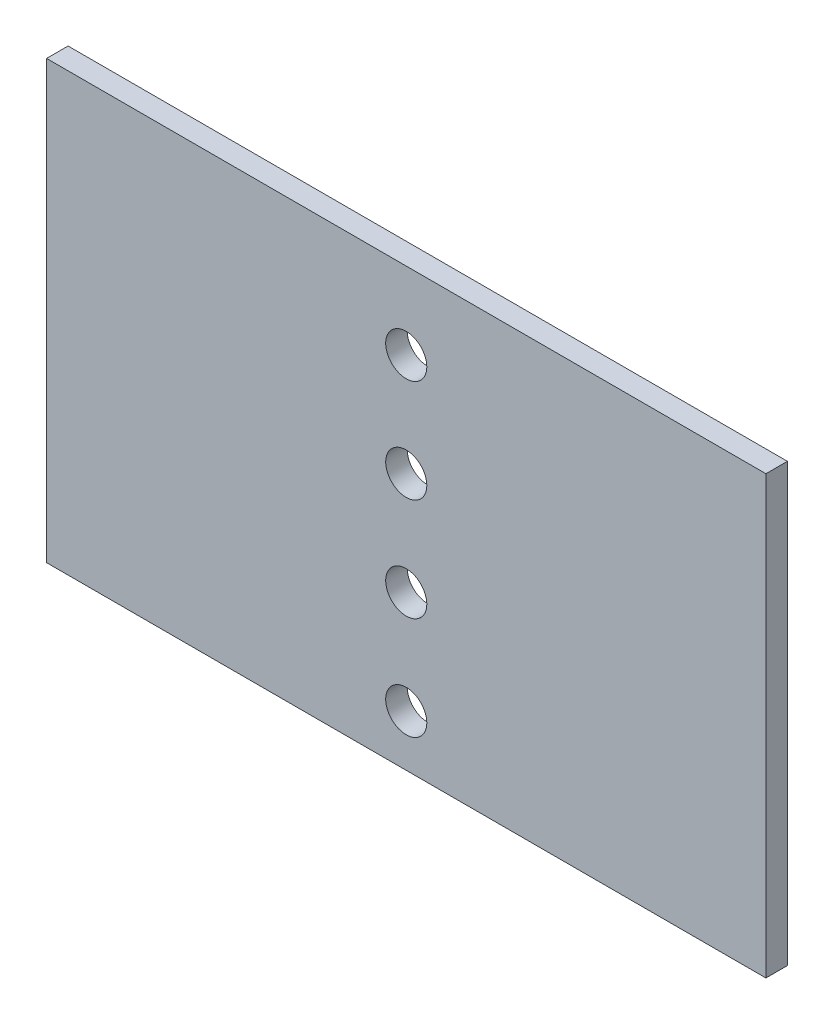
ISO-10303-21;
HEADER;
FILE_DESCRIPTION(('STEP AP214'),'2;1');
FILE_NAME('part.step','',(''),(''),'','','');
FILE_SCHEMA(('AUTOMOTIVE_DESIGN { 1 0 10303 214 1 1 1 1 }'));
ENDSEC;
DATA;
#1=APPLICATION_CONTEXT('core data for automotive mechanical design processes');
#2=APPLICATION_PROTOCOL_DEFINITION('international standard','automotive_design',2000,#1);
#3=PRODUCT_CONTEXT('',#1,'mechanical');
#4=PRODUCT('Part','Part','',(#3));
#5=PRODUCT_RELATED_PRODUCT_CATEGORY('part','',(#4));
#6=PRODUCT_DEFINITION_FORMATION('','',#4);
#7=PRODUCT_DEFINITION_CONTEXT('part definition',#1,'design');
#8=PRODUCT_DEFINITION('design','',#6,#7);
#9=PRODUCT_DEFINITION_SHAPE('','',#8);
#10=(LENGTH_UNIT() NAMED_UNIT(*) SI_UNIT(.MILLI.,.METRE.));
#11=(NAMED_UNIT(*) PLANE_ANGLE_UNIT() SI_UNIT($,.RADIAN.));
#12=(NAMED_UNIT(*) SI_UNIT($,.STERADIAN.) SOLID_ANGLE_UNIT());
#13=UNCERTAINTY_MEASURE_WITH_UNIT(LENGTH_MEASURE(1.E-05),#10,'distance_accuracy_value','');
#14=(GEOMETRIC_REPRESENTATION_CONTEXT(3) GLOBAL_UNCERTAINTY_ASSIGNED_CONTEXT((#13)) GLOBAL_UNIT_ASSIGNED_CONTEXT((#10,
#11,#12)) REPRESENTATION_CONTEXT('',''));
#15=CARTESIAN_POINT('',(0.,0.,0.));
#16=DIRECTION('',(0.,0.,1.));
#17=DIRECTION('',(1.,0.,0.));
#18=AXIS2_PLACEMENT_3D('',#15,#16,#17);
#19=CARTESIAN_POINT('',(0.,0.,2.65684));
#20=DIRECTION('',(1.,0.,0.));
#21=DIRECTION('',(0.,0.,-1.));
#22=AXIS2_PLACEMENT_3D('',#19,#20,#21);
#23=PLANE('',#22);
#24=DIRECTION('',(0.,-1.,0.));
#25=VECTOR('',#24,1.);
#26=CARTESIAN_POINT('',(0.,0.,0.));
#27=LINE('',#26,#25);
#28=CARTESIAN_POINT('',(0.,53.975,0.));
#29=VERTEX_POINT('',#28);
#30=CARTESIAN_POINT('',(0.,0.,0.));
#31=VERTEX_POINT('',#30);
#32=EDGE_CURVE('E107',#29,#31,#27,.T.);
#33=ORIENTED_EDGE('',*,*,#32,.T.);
#34=DIRECTION('',(0.,0.,-1.));
#35=VECTOR('',#34,1.);
#36=CARTESIAN_POINT('',(0.,0.,2.65684));
#37=LINE('',#36,#35);
#38=CARTESIAN_POINT('',(0.,0.,2.65684));
#39=VERTEX_POINT('',#38);
#40=EDGE_CURVE('E11',#39,#31,#37,.T.);
#41=ORIENTED_EDGE('',*,*,#40,.F.);
#42=DIRECTION('',(0.,-1.,0.));
#43=VECTOR('',#42,1.);
#44=CARTESIAN_POINT('',(0.,0.,2.65684));
#45=LINE('',#44,#43);
#46=CARTESIAN_POINT('',(0.,53.975,2.65684));
#47=VERTEX_POINT('',#46);
#48=EDGE_CURVE('E91',#47,#39,#45,.T.);
#49=ORIENTED_EDGE('',*,*,#48,.F.);
#50=DIRECTION('',(0.,0.,-1.));
#51=VECTOR('',#50,1.);
#52=CARTESIAN_POINT('',(0.,53.975,2.65684));
#53=LINE('',#52,#51);
#54=EDGE_CURVE('E103',#47,#29,#53,.T.);
#55=ORIENTED_EDGE('',*,*,#54,.T.);
#56=EDGE_LOOP('',(#33,#41,#49,#55));
#57=FACE_BOUND('',#56,.T.);
#58=ADVANCED_FACE('F39',(#57),#23,.F.);
#59=CARTESIAN_POINT('',(0.,0.,2.65684));
#60=DIRECTION('',(0.,1.,0.));
#61=DIRECTION('',(0.,0.,1.));
#62=AXIS2_PLACEMENT_3D('',#59,#60,#61);
#63=PLANE('',#62);
#64=DIRECTION('',(1.,0.,0.));
#65=VECTOR('',#64,1.);
#66=CARTESIAN_POINT('',(0.,0.,0.));
#67=LINE('',#66,#65);
#68=CARTESIAN_POINT('',(88.9,0.,0.));
#69=VERTEX_POINT('',#68);
#70=EDGE_CURVE('E96',#31,#69,#67,.T.);
#71=ORIENTED_EDGE('',*,*,#70,.T.);
#72=DIRECTION('',(0.,0.,-1.));
#73=VECTOR('',#72,1.);
#74=CARTESIAN_POINT('',(88.9,0.,2.65684));
#75=LINE('',#74,#73);
#76=CARTESIAN_POINT('',(88.9,0.,2.65684));
#77=VERTEX_POINT('',#76);
#78=EDGE_CURVE('E48',#77,#69,#75,.T.);
#79=ORIENTED_EDGE('',*,*,#78,.F.);
#80=DIRECTION('',(1.,0.,0.));
#81=VECTOR('',#80,1.);
#82=CARTESIAN_POINT('',(0.,0.,2.65684));
#83=LINE('',#82,#81);
#84=EDGE_CURVE('E86',#39,#77,#83,.T.);
#85=ORIENTED_EDGE('',*,*,#84,.F.);
#86=ORIENTED_EDGE('',*,*,#40,.T.);
#87=EDGE_LOOP('',(#71,#79,#85,#86));
#88=FACE_BOUND('',#87,.T.);
#89=ADVANCED_FACE('F95',(#88),#63,.F.);
#90=CARTESIAN_POINT('',(88.9,0.,2.65684));
#91=DIRECTION('',(-1.,0.,0.));
#92=DIRECTION('',(0.,0.,1.));
#93=AXIS2_PLACEMENT_3D('',#90,#91,#92);
#94=PLANE('',#93);
#95=DIRECTION('',(0.,1.,0.));
#96=VECTOR('',#95,1.);
#97=CARTESIAN_POINT('',(88.9,0.,0.));
#98=LINE('',#97,#96);
#99=CARTESIAN_POINT('',(88.9,53.975,0.));
#100=VERTEX_POINT('',#99);
#101=EDGE_CURVE('E73',#69,#100,#98,.T.);
#102=ORIENTED_EDGE('',*,*,#101,.T.);
#103=DIRECTION('',(0.,0.,-1.));
#104=VECTOR('',#103,1.);
#105=CARTESIAN_POINT('',(88.9,53.975,2.65684));
#106=LINE('',#105,#104);
#107=CARTESIAN_POINT('',(88.9,53.975,2.65684));
#108=VERTEX_POINT('',#107);
#109=EDGE_CURVE('E98',#108,#100,#106,.T.);
#110=ORIENTED_EDGE('',*,*,#109,.F.);
#111=DIRECTION('',(0.,1.,0.));
#112=VECTOR('',#111,1.);
#113=CARTESIAN_POINT('',(88.9,0.,2.65684));
#114=LINE('',#113,#112);
#115=EDGE_CURVE('E89',#77,#108,#114,.T.);
#116=ORIENTED_EDGE('',*,*,#115,.F.);
#117=ORIENTED_EDGE('',*,*,#78,.T.);
#118=EDGE_LOOP('',(#102,#110,#116,#117));
#119=FACE_BOUND('',#118,.T.);
#120=ADVANCED_FACE('F99',(#119),#94,.F.);
#121=CARTESIAN_POINT('',(0.,53.975,2.65684));
#122=DIRECTION('',(0.,-1.,0.));
#123=DIRECTION('',(0.,0.,-1.));
#124=AXIS2_PLACEMENT_3D('',#121,#122,#123);
#125=PLANE('',#124);
#126=DIRECTION('',(-1.,0.,0.));
#127=VECTOR('',#126,1.);
#128=CARTESIAN_POINT('',(0.,53.975,0.));
#129=LINE('',#128,#127);
#130=EDGE_CURVE('E79',#100,#29,#129,.T.);
#131=ORIENTED_EDGE('',*,*,#130,.T.);
#132=ORIENTED_EDGE('',*,*,#54,.F.);
#133=DIRECTION('',(-1.,0.,0.));
#134=VECTOR('',#133,1.);
#135=CARTESIAN_POINT('',(0.,53.975,2.65684));
#136=LINE('',#135,#134);
#137=EDGE_CURVE('E56',#108,#47,#136,.T.);
#138=ORIENTED_EDGE('',*,*,#137,.F.);
#139=ORIENTED_EDGE('',*,*,#109,.T.);
#140=EDGE_LOOP('',(#131,#132,#138,#139));
#141=FACE_BOUND('',#140,.T.);
#142=ADVANCED_FACE('F121',(#141),#125,.F.);
#143=CARTESIAN_POINT('',(0.,0.,2.65684));
#144=DIRECTION('',(0.,0.,-1.));
#145=DIRECTION('',(-1.,0.,0.));
#146=AXIS2_PLACEMENT_3D('',#143,#144,#145);
#147=PLANE('',#146);
#148=CARTESIAN_POINT('',(44.45,6.35,2.65684));
#149=DIRECTION('',(0.,0.,1.));
#150=DIRECTION('',(1.,0.,0.));
#151=AXIS2_PLACEMENT_3D('',#148,#149,#150);
#152=CIRCLE('',#151,2.54);
#153=CARTESIAN_POINT('',(46.99,6.35,2.65684));
#154=VERTEX_POINT('',#153);
#155=EDGE_CURVE('E152',#154,#154,#152,.T.);
#156=ORIENTED_EDGE('',*,*,#155,.F.);
#157=EDGE_LOOP('',(#156));
#158=FACE_BOUND('',#157,.T.);
#159=CARTESIAN_POINT('',(44.45,19.05,2.65684));
#160=DIRECTION('',(0.,0.,1.));
#161=DIRECTION('',(1.,0.,0.));
#162=AXIS2_PLACEMENT_3D('',#159,#160,#161);
#163=CIRCLE('',#162,2.54);
#164=CARTESIAN_POINT('',(46.99,19.05,2.65684));
#165=VERTEX_POINT('',#164);
#166=EDGE_CURVE('E144',#165,#165,#163,.T.);
#167=ORIENTED_EDGE('',*,*,#166,.F.);
#168=EDGE_LOOP('',(#167));
#169=FACE_BOUND('',#168,.T.);
#170=CARTESIAN_POINT('',(44.45,31.75,2.65684));
#171=DIRECTION('',(0.,0.,1.));
#172=DIRECTION('',(1.,0.,0.));
#173=AXIS2_PLACEMENT_3D('',#170,#171,#172);
#174=CIRCLE('',#173,2.54);
#175=CARTESIAN_POINT('',(46.99,31.75,2.65684));
#176=VERTEX_POINT('',#175);
#177=EDGE_CURVE('E136',#176,#176,#174,.T.);
#178=ORIENTED_EDGE('',*,*,#177,.F.);
#179=EDGE_LOOP('',(#178));
#180=FACE_BOUND('',#179,.T.);
#181=CARTESIAN_POINT('',(44.45,44.45,2.65684));
#182=DIRECTION('',(0.,0.,1.));
#183=DIRECTION('',(1.,0.,0.));
#184=AXIS2_PLACEMENT_3D('',#181,#182,#183);
#185=CIRCLE('',#184,2.54);
#186=CARTESIAN_POINT('',(46.99,44.45,2.65684));
#187=VERTEX_POINT('',#186);
#188=EDGE_CURVE('E128',#187,#187,#185,.T.);
#189=ORIENTED_EDGE('',*,*,#188,.F.);
#190=EDGE_LOOP('',(#189));
#191=FACE_BOUND('',#190,.T.);
#192=ORIENTED_EDGE('',*,*,#48,.T.);
#193=ORIENTED_EDGE('',*,*,#84,.T.);
#194=ORIENTED_EDGE('',*,*,#115,.T.);
#195=ORIENTED_EDGE('',*,*,#137,.T.);
#196=EDGE_LOOP('',(#192,#193,#194,#195));
#197=FACE_BOUND('',#196,.T.);
#198=ADVANCED_FACE('F87',(#158,#169,#180,#191,#197),#147,.F.);
#199=CARTESIAN_POINT('',(0.,0.,0.));
#200=DIRECTION('',(0.,0.,-1.));
#201=DIRECTION('',(-1.,0.,0.));
#202=AXIS2_PLACEMENT_3D('',#199,#200,#201);
#203=PLANE('',#202);
#204=CARTESIAN_POINT('',(44.45,6.35,0.));
#205=DIRECTION('',(0.,0.,1.));
#206=DIRECTION('',(1.,0.,0.));
#207=AXIS2_PLACEMENT_3D('',#204,#205,#206);
#208=CIRCLE('',#207,2.54);
#209=CARTESIAN_POINT('',(46.99,6.35,0.));
#210=VERTEX_POINT('',#209);
#211=EDGE_CURVE('E111',#210,#210,#208,.T.);
#212=ORIENTED_EDGE('',*,*,#211,.T.);
#213=EDGE_LOOP('',(#212));
#214=FACE_BOUND('',#213,.T.);
#215=CARTESIAN_POINT('',(44.45,19.05,0.));
#216=DIRECTION('',(0.,0.,1.));
#217=DIRECTION('',(1.,0.,0.));
#218=AXIS2_PLACEMENT_3D('',#215,#216,#217);
#219=CIRCLE('',#218,2.54);
#220=CARTESIAN_POINT('',(46.99,19.05,0.));
#221=VERTEX_POINT('',#220);
#222=EDGE_CURVE('E148',#221,#221,#219,.T.);
#223=ORIENTED_EDGE('',*,*,#222,.T.);
#224=EDGE_LOOP('',(#223));
#225=FACE_BOUND('',#224,.T.);
#226=CARTESIAN_POINT('',(44.45,31.75,0.));
#227=DIRECTION('',(0.,0.,1.));
#228=DIRECTION('',(1.,0.,0.));
#229=AXIS2_PLACEMENT_3D('',#226,#227,#228);
#230=CIRCLE('',#229,2.54);
#231=CARTESIAN_POINT('',(46.99,31.75,0.));
#232=VERTEX_POINT('',#231);
#233=EDGE_CURVE('E140',#232,#232,#230,.T.);
#234=ORIENTED_EDGE('',*,*,#233,.T.);
#235=EDGE_LOOP('',(#234));
#236=FACE_BOUND('',#235,.T.);
#237=CARTESIAN_POINT('',(44.45,44.45,0.));
#238=DIRECTION('',(0.,0.,1.));
#239=DIRECTION('',(1.,0.,0.));
#240=AXIS2_PLACEMENT_3D('',#237,#238,#239);
#241=CIRCLE('',#240,2.54);
#242=CARTESIAN_POINT('',(46.99,44.45,0.));
#243=VERTEX_POINT('',#242);
#244=EDGE_CURVE('E132',#243,#243,#241,.T.);
#245=ORIENTED_EDGE('',*,*,#244,.T.);
#246=EDGE_LOOP('',(#245));
#247=FACE_BOUND('',#246,.T.);
#248=ORIENTED_EDGE('',*,*,#32,.F.);
#249=ORIENTED_EDGE('',*,*,#130,.F.);
#250=ORIENTED_EDGE('',*,*,#101,.F.);
#251=ORIENTED_EDGE('',*,*,#70,.F.);
#252=EDGE_LOOP('',(#248,#249,#250,#251));
#253=FACE_BOUND('',#252,.T.);
#254=ADVANCED_FACE('F124',(#214,#225,#236,#247,#253),#203,.T.);
#255=CARTESIAN_POINT('',(44.45,44.45,0.));
#256=DIRECTION('',(0.,0.,1.));
#257=DIRECTION('',(1.,0.,0.));
#258=AXIS2_PLACEMENT_3D('',#255,#256,#257);
#259=CYLINDRICAL_SURFACE('',#258,2.54);
#260=CARTESIAN_POINT('',(46.99,44.45,0.));
#261=CARTESIAN_POINT('',(46.99,44.45,0.0276754166666666));
#262=CARTESIAN_POINT('',(46.99,44.45,0.0553508333333333));
#263=CARTESIAN_POINT('',(46.99,44.45,0.110701666666667));
#264=CARTESIAN_POINT('',(46.99,44.45,0.138377083333333));
#265=CARTESIAN_POINT('',(46.99,44.45,0.193727916666667));
#266=CARTESIAN_POINT('',(46.99,44.45,0.221403333333333));
#267=CARTESIAN_POINT('',(46.99,44.45,0.276754166666667));
#268=CARTESIAN_POINT('',(46.99,44.45,0.304429583333333));
#269=CARTESIAN_POINT('',(46.99,44.45,0.359780416666667));
#270=CARTESIAN_POINT('',(46.99,44.45,0.387455833333333));
#271=CARTESIAN_POINT('',(46.99,44.45,0.442806666666667));
#272=CARTESIAN_POINT('',(46.99,44.45,0.470482083333333));
#273=CARTESIAN_POINT('',(46.99,44.45,0.525832916666666));
#274=CARTESIAN_POINT('',(46.99,44.45,0.553508333333333));
#275=CARTESIAN_POINT('',(46.99,44.45,0.608859166666667));
#276=CARTESIAN_POINT('',(46.99,44.45,0.636534583333333));
#277=CARTESIAN_POINT('',(46.99,44.45,0.691885416666666));
#278=CARTESIAN_POINT('',(46.99,44.45,0.719560833333333));
#279=CARTESIAN_POINT('',(46.99,44.45,0.774911666666667));
#280=CARTESIAN_POINT('',(46.99,44.45,0.802587083333333));
#281=CARTESIAN_POINT('',(46.99,44.45,0.857937916666667));
#282=CARTESIAN_POINT('',(46.99,44.45,0.885613333333333));
#283=CARTESIAN_POINT('',(46.99,44.45,0.940964166666666));
#284=CARTESIAN_POINT('',(46.99,44.45,0.968639583333333));
#285=CARTESIAN_POINT('',(46.99,44.45,1.02399041666667));
#286=CARTESIAN_POINT('',(46.99,44.45,1.05166583333333));
#287=CARTESIAN_POINT('',(46.99,44.45,1.10701666666667));
#288=CARTESIAN_POINT('',(46.99,44.45,1.13469208333333));
#289=CARTESIAN_POINT('',(46.99,44.45,1.19004291666667));
#290=CARTESIAN_POINT('',(46.99,44.45,1.21771833333333));
#291=CARTESIAN_POINT('',(46.99,44.45,1.27306916666667));
#292=CARTESIAN_POINT('',(46.99,44.45,1.30074458333333));
#293=CARTESIAN_POINT('',(46.99,44.45,1.35609541666667));
#294=CARTESIAN_POINT('',(46.99,44.45,1.38377083333333));
#295=CARTESIAN_POINT('',(46.99,44.45,1.43912166666667));
#296=CARTESIAN_POINT('',(46.99,44.45,1.46679708333333));
#297=CARTESIAN_POINT('',(46.99,44.45,1.52214791666667));
#298=CARTESIAN_POINT('',(46.99,44.45,1.54982333333333));
#299=CARTESIAN_POINT('',(46.99,44.45,1.60517416666667));
#300=CARTESIAN_POINT('',(46.99,44.45,1.63284958333333));
#301=CARTESIAN_POINT('',(46.99,44.45,1.68820041666667));
#302=CARTESIAN_POINT('',(46.99,44.45,1.71587583333333));
#303=CARTESIAN_POINT('',(46.99,44.45,1.77122666666667));
#304=CARTESIAN_POINT('',(46.99,44.45,1.79890208333333));
#305=CARTESIAN_POINT('',(46.99,44.45,1.85425291666667));
#306=CARTESIAN_POINT('',(46.99,44.45,1.88192833333333));
#307=CARTESIAN_POINT('',(46.99,44.45,1.93727916666667));
#308=CARTESIAN_POINT('',(46.99,44.45,1.96495458333333));
#309=CARTESIAN_POINT('',(46.99,44.45,2.02030541666667));
#310=CARTESIAN_POINT('',(46.99,44.45,2.04798083333333));
#311=CARTESIAN_POINT('',(46.99,44.45,2.10333166666667));
#312=CARTESIAN_POINT('',(46.99,44.45,2.13100708333333));
#313=CARTESIAN_POINT('',(46.99,44.45,2.18635791666667));
#314=CARTESIAN_POINT('',(46.99,44.45,2.21403333333333));
#315=CARTESIAN_POINT('',(46.99,44.45,2.26938416666667));
#316=CARTESIAN_POINT('',(46.99,44.45,2.29705958333333));
#317=CARTESIAN_POINT('',(46.99,44.45,2.35241041666667));
#318=CARTESIAN_POINT('',(46.99,44.45,2.38008583333333));
#319=CARTESIAN_POINT('',(46.99,44.45,2.43543666666667));
#320=CARTESIAN_POINT('',(46.99,44.45,2.46311208333333));
#321=CARTESIAN_POINT('',(46.99,44.45,2.51846291666667));
#322=CARTESIAN_POINT('',(46.99,44.45,2.54613833333333));
#323=CARTESIAN_POINT('',(46.99,44.45,2.60148916666667));
#324=CARTESIAN_POINT('',(46.99,44.45,2.62916458333333));
#325=CARTESIAN_POINT('',(46.99,44.45,2.65684));
#326=B_SPLINE_CURVE_WITH_KNOTS('',3,(#260,#261,#262,#263,#264,#265,#266,#267,#268,#269,#270,
#271,#272,#273,#274,#275,#276,#277,#278,#279,#280,#281,#282,#283,#284,#285,#286,#287,#288,#289,
#290,#291,#292,#293,#294,#295,#296,#297,#298,#299,#300,#301,#302,#303,#304,#305,#306,#307,#308,
#309,#310,#311,#312,#313,#314,#315,#316,#317,#318,#319,#320,#321,#322,#323,#324,#325),
.UNSPECIFIED.,.F.,.F.,(4,2,2,2,2,2,2,2,2,2,2,2,2,2,2,2,2,2,2,2,2,2,2,2,2,2,2,2,2,2,2,2,4),(0.,
0.08302625,0.1660525,0.24907875,0.332105,0.41513125,0.4981575,0.58118375,0.66421,0.74723625,
0.8302625,0.91328875,0.996315,1.07934125,1.1623675,1.24539375,1.32842,1.41144625,1.4944725,
1.57749875,1.660525,1.74355125,1.8265775,1.90960375,1.99263,2.07565625,2.1586825,2.24170875,
2.324735,2.40776125,2.4907875,2.57381375,2.65684),.UNSPECIFIED.);
#327=EDGE_CURVE('BSEAM178',#243,#187,#326,.T.);
#328=ORIENTED_EDGE('',*,*,#244,.F.);
#329=ORIENTED_EDGE('',*,*,#188,.T.);
#330=ORIENTED_EDGE('',*,*,#327,.T.);
#331=ORIENTED_EDGE('',*,*,#327,.F.);
#332=EDGE_LOOP('',(#328,#330,#329,#331));
#333=FACE_BOUND('',#332,.T.);
#334=ADVANCED_FACE('F178',(#333),#259,.F.);
#335=CARTESIAN_POINT('',(44.45,31.75,0.));
#336=DIRECTION('',(0.,0.,1.));
#337=DIRECTION('',(1.,0.,0.));
#338=AXIS2_PLACEMENT_3D('',#335,#336,#337);
#339=CYLINDRICAL_SURFACE('',#338,2.54);
#340=CARTESIAN_POINT('',(46.99,31.75,0.));
#341=CARTESIAN_POINT('',(46.99,31.75,0.0276754166666666));
#342=CARTESIAN_POINT('',(46.99,31.75,0.0553508333333333));
#343=CARTESIAN_POINT('',(46.99,31.75,0.110701666666667));
#344=CARTESIAN_POINT('',(46.99,31.75,0.138377083333333));
#345=CARTESIAN_POINT('',(46.99,31.75,0.193727916666667));
#346=CARTESIAN_POINT('',(46.99,31.75,0.221403333333333));
#347=CARTESIAN_POINT('',(46.99,31.75,0.276754166666667));
#348=CARTESIAN_POINT('',(46.99,31.75,0.304429583333333));
#349=CARTESIAN_POINT('',(46.99,31.75,0.359780416666667));
#350=CARTESIAN_POINT('',(46.99,31.75,0.387455833333333));
#351=CARTESIAN_POINT('',(46.99,31.75,0.442806666666667));
#352=CARTESIAN_POINT('',(46.99,31.75,0.470482083333333));
#353=CARTESIAN_POINT('',(46.99,31.75,0.525832916666666));
#354=CARTESIAN_POINT('',(46.99,31.75,0.553508333333333));
#355=CARTESIAN_POINT('',(46.99,31.75,0.608859166666667));
#356=CARTESIAN_POINT('',(46.99,31.75,0.636534583333333));
#357=CARTESIAN_POINT('',(46.99,31.75,0.691885416666666));
#358=CARTESIAN_POINT('',(46.99,31.75,0.719560833333333));
#359=CARTESIAN_POINT('',(46.99,31.75,0.774911666666667));
#360=CARTESIAN_POINT('',(46.99,31.75,0.802587083333333));
#361=CARTESIAN_POINT('',(46.99,31.75,0.857937916666667));
#362=CARTESIAN_POINT('',(46.99,31.75,0.885613333333333));
#363=CARTESIAN_POINT('',(46.99,31.75,0.940964166666666));
#364=CARTESIAN_POINT('',(46.99,31.75,0.968639583333333));
#365=CARTESIAN_POINT('',(46.99,31.75,1.02399041666667));
#366=CARTESIAN_POINT('',(46.99,31.75,1.05166583333333));
#367=CARTESIAN_POINT('',(46.99,31.75,1.10701666666667));
#368=CARTESIAN_POINT('',(46.99,31.75,1.13469208333333));
#369=CARTESIAN_POINT('',(46.99,31.75,1.19004291666667));
#370=CARTESIAN_POINT('',(46.99,31.75,1.21771833333333));
#371=CARTESIAN_POINT('',(46.99,31.75,1.27306916666667));
#372=CARTESIAN_POINT('',(46.99,31.75,1.30074458333333));
#373=CARTESIAN_POINT('',(46.99,31.75,1.35609541666667));
#374=CARTESIAN_POINT('',(46.99,31.75,1.38377083333333));
#375=CARTESIAN_POINT('',(46.99,31.75,1.43912166666667));
#376=CARTESIAN_POINT('',(46.99,31.75,1.46679708333333));
#377=CARTESIAN_POINT('',(46.99,31.75,1.52214791666667));
#378=CARTESIAN_POINT('',(46.99,31.75,1.54982333333333));
#379=CARTESIAN_POINT('',(46.99,31.75,1.60517416666667));
#380=CARTESIAN_POINT('',(46.99,31.75,1.63284958333333));
#381=CARTESIAN_POINT('',(46.99,31.75,1.68820041666667));
#382=CARTESIAN_POINT('',(46.99,31.75,1.71587583333333));
#383=CARTESIAN_POINT('',(46.99,31.75,1.77122666666667));
#384=CARTESIAN_POINT('',(46.99,31.75,1.79890208333333));
#385=CARTESIAN_POINT('',(46.99,31.75,1.85425291666667));
#386=CARTESIAN_POINT('',(46.99,31.75,1.88192833333333));
#387=CARTESIAN_POINT('',(46.99,31.75,1.93727916666667));
#388=CARTESIAN_POINT('',(46.99,31.75,1.96495458333333));
#389=CARTESIAN_POINT('',(46.99,31.75,2.02030541666667));
#390=CARTESIAN_POINT('',(46.99,31.75,2.04798083333333));
#391=CARTESIAN_POINT('',(46.99,31.75,2.10333166666667));
#392=CARTESIAN_POINT('',(46.99,31.75,2.13100708333333));
#393=CARTESIAN_POINT('',(46.99,31.75,2.18635791666667));
#394=CARTESIAN_POINT('',(46.99,31.75,2.21403333333333));
#395=CARTESIAN_POINT('',(46.99,31.75,2.26938416666667));
#396=CARTESIAN_POINT('',(46.99,31.75,2.29705958333333));
#397=CARTESIAN_POINT('',(46.99,31.75,2.35241041666667));
#398=CARTESIAN_POINT('',(46.99,31.75,2.38008583333333));
#399=CARTESIAN_POINT('',(46.99,31.75,2.43543666666667));
#400=CARTESIAN_POINT('',(46.99,31.75,2.46311208333333));
#401=CARTESIAN_POINT('',(46.99,31.75,2.51846291666667));
#402=CARTESIAN_POINT('',(46.99,31.75,2.54613833333333));
#403=CARTESIAN_POINT('',(46.99,31.75,2.60148916666667));
#404=CARTESIAN_POINT('',(46.99,31.75,2.62916458333333));
#405=CARTESIAN_POINT('',(46.99,31.75,2.65684));
#406=B_SPLINE_CURVE_WITH_KNOTS('',3,(#340,#341,#342,#343,#344,#345,#346,#347,#348,#349,#350,
#351,#352,#353,#354,#355,#356,#357,#358,#359,#360,#361,#362,#363,#364,#365,#366,#367,#368,#369,
#370,#371,#372,#373,#374,#375,#376,#377,#378,#379,#380,#381,#382,#383,#384,#385,#386,#387,#388,
#389,#390,#391,#392,#393,#394,#395,#396,#397,#398,#399,#400,#401,#402,#403,#404,#405),
.UNSPECIFIED.,.F.,.F.,(4,2,2,2,2,2,2,2,2,2,2,2,2,2,2,2,2,2,2,2,2,2,2,2,2,2,2,2,2,2,2,2,4),(0.,
0.08302625,0.1660525,0.24907875,0.332105,0.41513125,0.4981575,0.58118375,0.66421,0.74723625,
0.8302625,0.91328875,0.996315,1.07934125,1.1623675,1.24539375,1.32842,1.41144625,1.4944725,
1.57749875,1.660525,1.74355125,1.8265775,1.90960375,1.99263,2.07565625,2.1586825,2.24170875,
2.324735,2.40776125,2.4907875,2.57381375,2.65684),.UNSPECIFIED.);
#407=EDGE_CURVE('BSEAM180',#232,#176,#406,.T.);
#408=ORIENTED_EDGE('',*,*,#233,.F.);
#409=ORIENTED_EDGE('',*,*,#177,.T.);
#410=ORIENTED_EDGE('',*,*,#407,.T.);
#411=ORIENTED_EDGE('',*,*,#407,.F.);
#412=EDGE_LOOP('',(#408,#410,#409,#411));
#413=FACE_BOUND('',#412,.T.);
#414=ADVANCED_FACE('F180',(#413),#339,.F.);
#415=CARTESIAN_POINT('',(44.45,19.05,0.));
#416=DIRECTION('',(0.,0.,1.));
#417=DIRECTION('',(1.,0.,0.));
#418=AXIS2_PLACEMENT_3D('',#415,#416,#417);
#419=CYLINDRICAL_SURFACE('',#418,2.54);
#420=CARTESIAN_POINT('',(46.99,19.05,0.));
#421=CARTESIAN_POINT('',(46.99,19.05,0.0276754166666666));
#422=CARTESIAN_POINT('',(46.99,19.05,0.0553508333333333));
#423=CARTESIAN_POINT('',(46.99,19.05,0.110701666666667));
#424=CARTESIAN_POINT('',(46.99,19.05,0.138377083333333));
#425=CARTESIAN_POINT('',(46.99,19.05,0.193727916666667));
#426=CARTESIAN_POINT('',(46.99,19.05,0.221403333333333));
#427=CARTESIAN_POINT('',(46.99,19.05,0.276754166666667));
#428=CARTESIAN_POINT('',(46.99,19.05,0.304429583333333));
#429=CARTESIAN_POINT('',(46.99,19.05,0.359780416666667));
#430=CARTESIAN_POINT('',(46.99,19.05,0.387455833333333));
#431=CARTESIAN_POINT('',(46.99,19.05,0.442806666666667));
#432=CARTESIAN_POINT('',(46.99,19.05,0.470482083333333));
#433=CARTESIAN_POINT('',(46.99,19.05,0.525832916666666));
#434=CARTESIAN_POINT('',(46.99,19.05,0.553508333333333));
#435=CARTESIAN_POINT('',(46.99,19.05,0.608859166666667));
#436=CARTESIAN_POINT('',(46.99,19.05,0.636534583333333));
#437=CARTESIAN_POINT('',(46.99,19.05,0.691885416666666));
#438=CARTESIAN_POINT('',(46.99,19.05,0.719560833333333));
#439=CARTESIAN_POINT('',(46.99,19.05,0.774911666666667));
#440=CARTESIAN_POINT('',(46.99,19.05,0.802587083333333));
#441=CARTESIAN_POINT('',(46.99,19.05,0.857937916666667));
#442=CARTESIAN_POINT('',(46.99,19.05,0.885613333333333));
#443=CARTESIAN_POINT('',(46.99,19.05,0.940964166666666));
#444=CARTESIAN_POINT('',(46.99,19.05,0.968639583333333));
#445=CARTESIAN_POINT('',(46.99,19.05,1.02399041666667));
#446=CARTESIAN_POINT('',(46.99,19.05,1.05166583333333));
#447=CARTESIAN_POINT('',(46.99,19.05,1.10701666666667));
#448=CARTESIAN_POINT('',(46.99,19.05,1.13469208333333));
#449=CARTESIAN_POINT('',(46.99,19.05,1.19004291666667));
#450=CARTESIAN_POINT('',(46.99,19.05,1.21771833333333));
#451=CARTESIAN_POINT('',(46.99,19.05,1.27306916666667));
#452=CARTESIAN_POINT('',(46.99,19.05,1.30074458333333));
#453=CARTESIAN_POINT('',(46.99,19.05,1.35609541666667));
#454=CARTESIAN_POINT('',(46.99,19.05,1.38377083333333));
#455=CARTESIAN_POINT('',(46.99,19.05,1.43912166666667));
#456=CARTESIAN_POINT('',(46.99,19.05,1.46679708333333));
#457=CARTESIAN_POINT('',(46.99,19.05,1.52214791666667));
#458=CARTESIAN_POINT('',(46.99,19.05,1.54982333333333));
#459=CARTESIAN_POINT('',(46.99,19.05,1.60517416666667));
#460=CARTESIAN_POINT('',(46.99,19.05,1.63284958333333));
#461=CARTESIAN_POINT('',(46.99,19.05,1.68820041666667));
#462=CARTESIAN_POINT('',(46.99,19.05,1.71587583333333));
#463=CARTESIAN_POINT('',(46.99,19.05,1.77122666666667));
#464=CARTESIAN_POINT('',(46.99,19.05,1.79890208333333));
#465=CARTESIAN_POINT('',(46.99,19.05,1.85425291666667));
#466=CARTESIAN_POINT('',(46.99,19.05,1.88192833333333));
#467=CARTESIAN_POINT('',(46.99,19.05,1.93727916666667));
#468=CARTESIAN_POINT('',(46.99,19.05,1.96495458333333));
#469=CARTESIAN_POINT('',(46.99,19.05,2.02030541666667));
#470=CARTESIAN_POINT('',(46.99,19.05,2.04798083333333));
#471=CARTESIAN_POINT('',(46.99,19.05,2.10333166666667));
#472=CARTESIAN_POINT('',(46.99,19.05,2.13100708333333));
#473=CARTESIAN_POINT('',(46.99,19.05,2.18635791666667));
#474=CARTESIAN_POINT('',(46.99,19.05,2.21403333333333));
#475=CARTESIAN_POINT('',(46.99,19.05,2.26938416666667));
#476=CARTESIAN_POINT('',(46.99,19.05,2.29705958333333));
#477=CARTESIAN_POINT('',(46.99,19.05,2.35241041666667));
#478=CARTESIAN_POINT('',(46.99,19.05,2.38008583333333));
#479=CARTESIAN_POINT('',(46.99,19.05,2.43543666666667));
#480=CARTESIAN_POINT('',(46.99,19.05,2.46311208333333));
#481=CARTESIAN_POINT('',(46.99,19.05,2.51846291666667));
#482=CARTESIAN_POINT('',(46.99,19.05,2.54613833333333));
#483=CARTESIAN_POINT('',(46.99,19.05,2.60148916666667));
#484=CARTESIAN_POINT('',(46.99,19.05,2.62916458333333));
#485=CARTESIAN_POINT('',(46.99,19.05,2.65684));
#486=B_SPLINE_CURVE_WITH_KNOTS('',3,(#420,#421,#422,#423,#424,#425,#426,#427,#428,#429,#430,
#431,#432,#433,#434,#435,#436,#437,#438,#439,#440,#441,#442,#443,#444,#445,#446,#447,#448,#449,
#450,#451,#452,#453,#454,#455,#456,#457,#458,#459,#460,#461,#462,#463,#464,#465,#466,#467,#468,
#469,#470,#471,#472,#473,#474,#475,#476,#477,#478,#479,#480,#481,#482,#483,#484,#485),
.UNSPECIFIED.,.F.,.F.,(4,2,2,2,2,2,2,2,2,2,2,2,2,2,2,2,2,2,2,2,2,2,2,2,2,2,2,2,2,2,2,2,4),(0.,
0.08302625,0.1660525,0.24907875,0.332105,0.41513125,0.4981575,0.58118375,0.66421,0.74723625,
0.8302625,0.91328875,0.996315,1.07934125,1.1623675,1.24539375,1.32842,1.41144625,1.4944725,
1.57749875,1.660525,1.74355125,1.8265775,1.90960375,1.99263,2.07565625,2.1586825,2.24170875,
2.324735,2.40776125,2.4907875,2.57381375,2.65684),.UNSPECIFIED.);
#487=EDGE_CURVE('BSEAM165',#221,#165,#486,.T.);
#488=ORIENTED_EDGE('',*,*,#222,.F.);
#489=ORIENTED_EDGE('',*,*,#166,.T.);
#490=ORIENTED_EDGE('',*,*,#487,.T.);
#491=ORIENTED_EDGE('',*,*,#487,.F.);
#492=EDGE_LOOP('',(#488,#490,#489,#491));
#493=FACE_BOUND('',#492,.T.);
#494=ADVANCED_FACE('F165',(#493),#419,.F.);
#495=CARTESIAN_POINT('',(44.45,6.35,0.));
#496=DIRECTION('',(0.,0.,1.));
#497=DIRECTION('',(1.,0.,0.));
#498=AXIS2_PLACEMENT_3D('',#495,#496,#497);
#499=CYLINDRICAL_SURFACE('',#498,2.54);
#500=CARTESIAN_POINT('',(46.99,6.35,0.));
#501=CARTESIAN_POINT('',(46.99,6.35,0.0276754166666666));
#502=CARTESIAN_POINT('',(46.99,6.35,0.0553508333333333));
#503=CARTESIAN_POINT('',(46.99,6.35,0.110701666666667));
#504=CARTESIAN_POINT('',(46.99,6.35,0.138377083333333));
#505=CARTESIAN_POINT('',(46.99,6.35,0.193727916666667));
#506=CARTESIAN_POINT('',(46.99,6.35,0.221403333333333));
#507=CARTESIAN_POINT('',(46.99,6.35,0.276754166666667));
#508=CARTESIAN_POINT('',(46.99,6.35,0.304429583333333));
#509=CARTESIAN_POINT('',(46.99,6.35,0.359780416666667));
#510=CARTESIAN_POINT('',(46.99,6.35,0.387455833333333));
#511=CARTESIAN_POINT('',(46.99,6.35,0.442806666666667));
#512=CARTESIAN_POINT('',(46.99,6.35,0.470482083333333));
#513=CARTESIAN_POINT('',(46.99,6.35,0.525832916666666));
#514=CARTESIAN_POINT('',(46.99,6.35,0.553508333333333));
#515=CARTESIAN_POINT('',(46.99,6.35,0.608859166666667));
#516=CARTESIAN_POINT('',(46.99,6.35,0.636534583333333));
#517=CARTESIAN_POINT('',(46.99,6.35,0.691885416666666));
#518=CARTESIAN_POINT('',(46.99,6.35,0.719560833333333));
#519=CARTESIAN_POINT('',(46.99,6.35,0.774911666666667));
#520=CARTESIAN_POINT('',(46.99,6.35,0.802587083333333));
#521=CARTESIAN_POINT('',(46.99,6.35,0.857937916666667));
#522=CARTESIAN_POINT('',(46.99,6.35,0.885613333333333));
#523=CARTESIAN_POINT('',(46.99,6.35,0.940964166666666));
#524=CARTESIAN_POINT('',(46.99,6.35,0.968639583333333));
#525=CARTESIAN_POINT('',(46.99,6.35,1.02399041666667));
#526=CARTESIAN_POINT('',(46.99,6.35,1.05166583333333));
#527=CARTESIAN_POINT('',(46.99,6.35,1.10701666666667));
#528=CARTESIAN_POINT('',(46.99,6.35,1.13469208333333));
#529=CARTESIAN_POINT('',(46.99,6.35,1.19004291666667));
#530=CARTESIAN_POINT('',(46.99,6.35,1.21771833333333));
#531=CARTESIAN_POINT('',(46.99,6.35,1.27306916666667));
#532=CARTESIAN_POINT('',(46.99,6.35,1.30074458333333));
#533=CARTESIAN_POINT('',(46.99,6.35,1.35609541666667));
#534=CARTESIAN_POINT('',(46.99,6.35,1.38377083333333));
#535=CARTESIAN_POINT('',(46.99,6.35,1.43912166666667));
#536=CARTESIAN_POINT('',(46.99,6.35,1.46679708333333));
#537=CARTESIAN_POINT('',(46.99,6.35,1.52214791666667));
#538=CARTESIAN_POINT('',(46.99,6.35,1.54982333333333));
#539=CARTESIAN_POINT('',(46.99,6.35,1.60517416666667));
#540=CARTESIAN_POINT('',(46.99,6.35,1.63284958333333));
#541=CARTESIAN_POINT('',(46.99,6.35,1.68820041666667));
#542=CARTESIAN_POINT('',(46.99,6.35,1.71587583333333));
#543=CARTESIAN_POINT('',(46.99,6.35,1.77122666666667));
#544=CARTESIAN_POINT('',(46.99,6.35,1.79890208333333));
#545=CARTESIAN_POINT('',(46.99,6.35,1.85425291666667));
#546=CARTESIAN_POINT('',(46.99,6.35,1.88192833333333));
#547=CARTESIAN_POINT('',(46.99,6.35,1.93727916666667));
#548=CARTESIAN_POINT('',(46.99,6.35,1.96495458333333));
#549=CARTESIAN_POINT('',(46.99,6.35,2.02030541666667));
#550=CARTESIAN_POINT('',(46.99,6.35,2.04798083333333));
#551=CARTESIAN_POINT('',(46.99,6.35,2.10333166666667));
#552=CARTESIAN_POINT('',(46.99,6.35,2.13100708333333));
#553=CARTESIAN_POINT('',(46.99,6.35,2.18635791666667));
#554=CARTESIAN_POINT('',(46.99,6.35,2.21403333333333));
#555=CARTESIAN_POINT('',(46.99,6.35,2.26938416666667));
#556=CARTESIAN_POINT('',(46.99,6.35,2.29705958333333));
#557=CARTESIAN_POINT('',(46.99,6.35,2.35241041666667));
#558=CARTESIAN_POINT('',(46.99,6.35,2.38008583333333));
#559=CARTESIAN_POINT('',(46.99,6.35,2.43543666666667));
#560=CARTESIAN_POINT('',(46.99,6.35,2.46311208333333));
#561=CARTESIAN_POINT('',(46.99,6.35,2.51846291666667));
#562=CARTESIAN_POINT('',(46.99,6.35,2.54613833333333));
#563=CARTESIAN_POINT('',(46.99,6.35,2.60148916666667));
#564=CARTESIAN_POINT('',(46.99,6.35,2.62916458333333));
#565=CARTESIAN_POINT('',(46.99,6.35,2.65684));
#566=B_SPLINE_CURVE_WITH_KNOTS('',3,(#500,#501,#502,#503,#504,#505,#506,#507,#508,#509,#510,
#511,#512,#513,#514,#515,#516,#517,#518,#519,#520,#521,#522,#523,#524,#525,#526,#527,#528,#529,
#530,#531,#532,#533,#534,#535,#536,#537,#538,#539,#540,#541,#542,#543,#544,#545,#546,#547,#548,
#549,#550,#551,#552,#553,#554,#555,#556,#557,#558,#559,#560,#561,#562,#563,#564,#565),
.UNSPECIFIED.,.F.,.F.,(4,2,2,2,2,2,2,2,2,2,2,2,2,2,2,2,2,2,2,2,2,2,2,2,2,2,2,2,2,2,2,2,4),(0.,
0.08302625,0.1660525,0.24907875,0.332105,0.41513125,0.4981575,0.58118375,0.66421,0.74723625,
0.8302625,0.91328875,0.996315,1.07934125,1.1623675,1.24539375,1.32842,1.41144625,1.4944725,
1.57749875,1.660525,1.74355125,1.8265775,1.90960375,1.99263,2.07565625,2.1586825,2.24170875,
2.324735,2.40776125,2.4907875,2.57381375,2.65684),.UNSPECIFIED.);
#567=EDGE_CURVE('BSEAM162',#210,#154,#566,.T.);
#568=ORIENTED_EDGE('',*,*,#211,.F.);
#569=ORIENTED_EDGE('',*,*,#155,.T.);
#570=ORIENTED_EDGE('',*,*,#567,.T.);
#571=ORIENTED_EDGE('',*,*,#567,.F.);
#572=EDGE_LOOP('',(#568,#570,#569,#571));
#573=FACE_BOUND('',#572,.T.);
#574=ADVANCED_FACE('F162',(#573),#499,.F.);
#575=CLOSED_SHELL('',(#58,#89,#120,#142,#198,#254,#334,#414,#494,#574));
#576=MANIFOLD_SOLID_BREP('B2',#575);
#577=ADVANCED_BREP_SHAPE_REPRESENTATION('',(#18,#576),#14);
#578=SHAPE_DEFINITION_REPRESENTATION(#9,#577);
ENDSEC;
END-ISO-10303-21;
